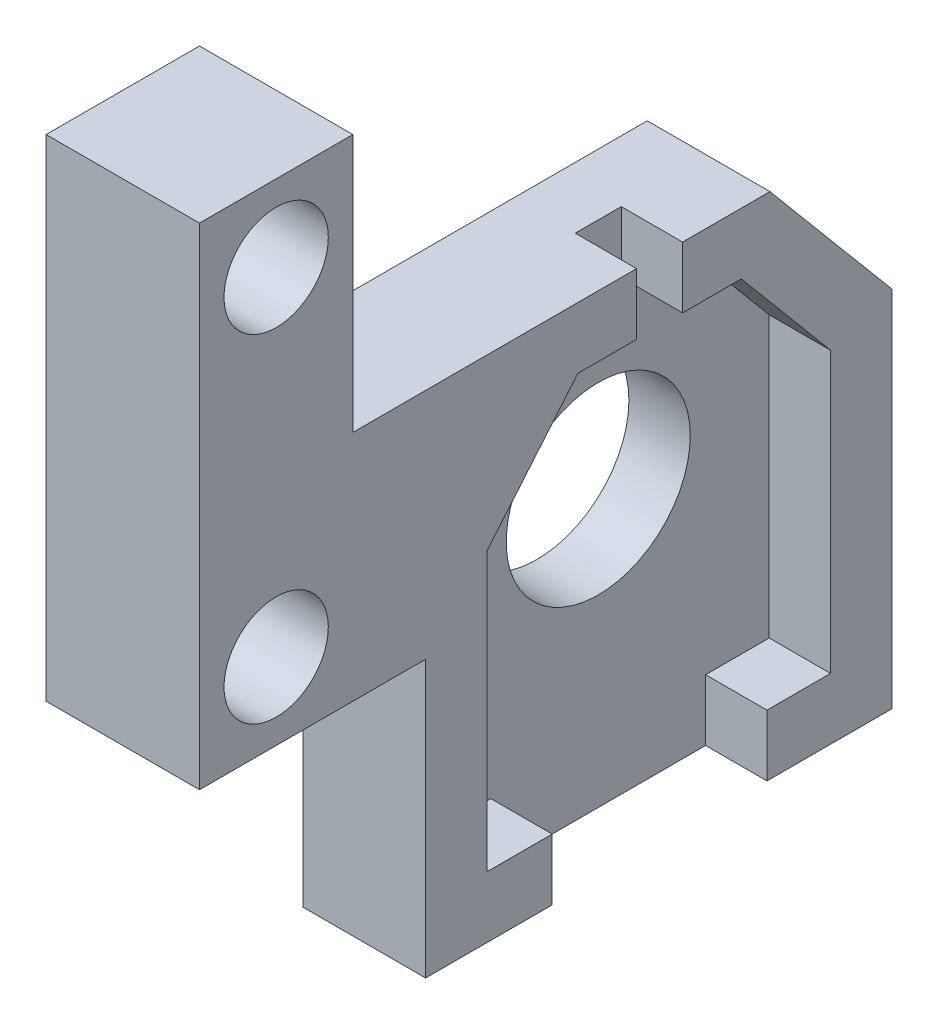
ISO-10303-21;
HEADER;
FILE_DESCRIPTION(('STEP AP214'),'2;1');
FILE_NAME('part.step','',(''),(''),'','','');
FILE_SCHEMA(('AUTOMOTIVE_DESIGN { 1 0 10303 214 1 1 1 1 }'));
ENDSEC;
DATA;
#1=APPLICATION_CONTEXT('core data for automotive mechanical design processes');
#2=APPLICATION_PROTOCOL_DEFINITION('international standard','automotive_design',2000,#1);
#3=PRODUCT_CONTEXT('',#1,'mechanical');
#4=PRODUCT('Part','Part','',(#3));
#5=PRODUCT_RELATED_PRODUCT_CATEGORY('part','',(#4));
#6=PRODUCT_DEFINITION_FORMATION('','',#4);
#7=PRODUCT_DEFINITION_CONTEXT('part definition',#1,'design');
#8=PRODUCT_DEFINITION('design','',#6,#7);
#9=PRODUCT_DEFINITION_SHAPE('','',#8);
#10=(LENGTH_UNIT() NAMED_UNIT(*) SI_UNIT(.MILLI.,.METRE.));
#11=(NAMED_UNIT(*) PLANE_ANGLE_UNIT() SI_UNIT($,.RADIAN.));
#12=(NAMED_UNIT(*) SI_UNIT($,.STERADIAN.) SOLID_ANGLE_UNIT());
#13=UNCERTAINTY_MEASURE_WITH_UNIT(LENGTH_MEASURE(1.E-05),#10,'distance_accuracy_value','');
#14=(GEOMETRIC_REPRESENTATION_CONTEXT(3) GLOBAL_UNCERTAINTY_ASSIGNED_CONTEXT((#13)) GLOBAL_UNIT_ASSIGNED_CONTEXT((#10,
#11,#12)) REPRESENTATION_CONTEXT('',''));
#15=CARTESIAN_POINT('',(0.,0.,0.));
#16=DIRECTION('',(0.,0.,1.));
#17=DIRECTION('',(1.,0.,0.));
#18=AXIS2_PLACEMENT_3D('',#15,#16,#17);
#19=CARTESIAN_POINT('',(0.,0.,0.));
#20=DIRECTION('',(-1.,0.,0.));
#21=DIRECTION('',(0.,0.,1.));
#22=AXIS2_PLACEMENT_3D('',#19,#20,#21);
#23=PLANE('',#22);
#24=CARTESIAN_POINT('',(0.,1.90865976235804,0.482116569244563));
#25=DIRECTION('',(1.,0.,0.));
#26=DIRECTION('',(0.,0.,-1.));
#27=AXIS2_PLACEMENT_3D('',#24,#25,#26);
#28=CIRCLE('',#27,3.);
#29=CARTESIAN_POINT('',(0.,1.90865976235804,-2.51788343075544));
#30=VERTEX_POINT('',#29);
#31=EDGE_CURVE('E226',#30,#30,#28,.T.);
#32=ORIENTED_EDGE('',*,*,#31,.F.);
#33=EDGE_LOOP('',(#32));
#34=FACE_BOUND('',#33,.T.);
#35=DIRECTION('',(0.,1.,0.));
#36=VECTOR('',#35,1.);
#37=CARTESIAN_POINT('',(0.,7.49865976235804,1.23211656924456));
#38=LINE('',#37,#36);
#39=CARTESIAN_POINT('',(0.,7.49865976235804,1.23211656924456));
#40=VERTEX_POINT('',#39);
#41=CARTESIAN_POINT('',(0.,9.49865976235804,1.23211656924456));
#42=VERTEX_POINT('',#41);
#43=EDGE_CURVE('E65',#40,#42,#38,.T.);
#44=ORIENTED_EDGE('',*,*,#43,.F.);
#45=DIRECTION('',(0.,0.,-1.));
#46=VECTOR('',#45,1.);
#47=CARTESIAN_POINT('',(0.,7.49865976235804,3.14728681258254));
#48=LINE('',#47,#46);
#49=CARTESIAN_POINT('',(0.,7.49865976235804,3.14728681258254));
#50=VERTEX_POINT('',#49);
#51=EDGE_CURVE('E417',#50,#40,#48,.T.);
#52=ORIENTED_EDGE('',*,*,#51,.F.);
#53=DIRECTION('',(0.,0.766044443118982,-0.642787609686534));
#54=VECTOR('',#53,1.);
#55=CARTESIAN_POINT('',(0.,3.96865976235804,6.1093085106383));
#56=LINE('',#55,#54);
#57=CARTESIAN_POINT('',(0.,3.96865976235804,6.1093085106383));
#58=VERTEX_POINT('',#57);
#59=EDGE_CURVE('E413',#58,#50,#56,.T.);
#60=ORIENTED_EDGE('',*,*,#59,.F.);
#61=DIRECTION('',(0.,1.,0.));
#62=VECTOR('',#61,1.);
#63=CARTESIAN_POINT('',(0.,3.96865976235804,6.1093085106383));
#64=LINE('',#63,#62);
#65=CARTESIAN_POINT('',(0.,-5.09134023764196,6.1093085106383));
#66=VERTEX_POINT('',#65);
#67=EDGE_CURVE('E408',#66,#58,#64,.T.);
#68=ORIENTED_EDGE('',*,*,#67,.F.);
#69=DIRECTION('',(0.,0.,1.));
#70=VECTOR('',#69,1.);
#71=CARTESIAN_POINT('',(0.,-5.09134023764196,6.1093085106383));
#72=LINE('',#71,#70);
#73=CARTESIAN_POINT('',(0.,-5.09134023764196,3.98211656924456));
#74=VERTEX_POINT('',#73);
#75=EDGE_CURVE('E404',#74,#66,#72,.T.);
#76=ORIENTED_EDGE('',*,*,#75,.F.);
#77=DIRECTION('',(0.,1.,0.));
#78=VECTOR('',#77,1.);
#79=CARTESIAN_POINT('',(0.,-5.09134023764196,3.98211656924456));
#80=LINE('',#79,#78);
#81=CARTESIAN_POINT('',(0.,-7.09134023764196,3.98211656924456));
#82=VERTEX_POINT('',#81);
#83=EDGE_CURVE('E422',#82,#74,#80,.T.);
#84=ORIENTED_EDGE('',*,*,#83,.F.);
#85=DIRECTION('',(0.,0.,-1.));
#86=VECTOR('',#85,1.);
#87=CARTESIAN_POINT('',(0.,-7.09134023764196,-7.0906914893617));
#88=LINE('',#87,#86);
#89=CARTESIAN_POINT('',(0.,-7.09134023764196,-3.01788343075544));
#90=VERTEX_POINT('',#89);
#91=EDGE_CURVE('E245',#82,#90,#88,.T.);
#92=ORIENTED_EDGE('',*,*,#91,.T.);
#93=DIRECTION('',(0.,-1.,0.));
#94=VECTOR('',#93,1.);
#95=CARTESIAN_POINT('',(0.,-5.09134023764196,-3.01788343075544));
#96=LINE('',#95,#94);
#97=CARTESIAN_POINT('',(0.,-5.09134023764196,-3.01788343075544));
#98=VERTEX_POINT('',#97);
#99=EDGE_CURVE('E305',#98,#90,#96,.T.);
#100=ORIENTED_EDGE('',*,*,#99,.F.);
#101=DIRECTION('',(0.,0.,1.));
#102=VECTOR('',#101,1.);
#103=CARTESIAN_POINT('',(0.,-5.09134023764196,-3.01788343075544));
#104=LINE('',#103,#102);
#105=CARTESIAN_POINT('',(0.,-5.09134023764196,-5.0906914893617));
#106=VERTEX_POINT('',#105);
#107=EDGE_CURVE('E301',#106,#98,#104,.T.);
#108=ORIENTED_EDGE('',*,*,#107,.F.);
#109=DIRECTION('',(0.,-1.,0.));
#110=VECTOR('',#109,1.);
#111=CARTESIAN_POINT('',(0.,4.03347195004924,-5.0906914893617));
#112=LINE('',#111,#110);
#113=CARTESIAN_POINT('',(0.,4.03347195004924,-5.0906914893617));
#114=VERTEX_POINT('',#113);
#115=EDGE_CURVE('E297',#114,#106,#112,.T.);
#116=ORIENTED_EDGE('',*,*,#115,.F.);
#117=DIRECTION('',(0.,-0.766044443118981,-0.642787609686535));
#118=VECTOR('',#117,1.);
#119=CARTESIAN_POINT('',(0.,4.03347195004924,-5.0906914893617));
#120=LINE('',#119,#118);
#121=CARTESIAN_POINT('',(0.,7.49865976235804,-2.18305367409341));
#122=VERTEX_POINT('',#121);
#123=EDGE_CURVE('E292',#122,#114,#120,.T.);
#124=ORIENTED_EDGE('',*,*,#123,.F.);
#125=DIRECTION('',(0.,0.,-1.));
#126=VECTOR('',#125,1.);
#127=CARTESIAN_POINT('',(0.,7.49865976235804,-0.267883430755437));
#128=LINE('',#127,#126);
#129=CARTESIAN_POINT('',(0.,7.49865976235804,-0.267883430755437));
#130=VERTEX_POINT('',#129);
#131=EDGE_CURVE('E288',#130,#122,#128,.T.);
#132=ORIENTED_EDGE('',*,*,#131,.F.);
#133=DIRECTION('',(0.,-1.,0.));
#134=VECTOR('',#133,1.);
#135=CARTESIAN_POINT('',(0.,7.49865976235804,-0.267883430755437));
#136=LINE('',#135,#134);
#137=CARTESIAN_POINT('',(0.,9.49865976235804,-0.267883430755437));
#138=VERTEX_POINT('',#137);
#139=EDGE_CURVE('E309',#138,#130,#136,.T.);
#140=ORIENTED_EDGE('',*,*,#139,.F.);
#141=DIRECTION('',(0.,0.,1.));
#142=VECTOR('',#141,1.);
#143=CARTESIAN_POINT('',(0.,9.49865976235804,4.07990212889255));
#144=LINE('',#143,#142);
#145=EDGE_CURVE('E248',#138,#42,#144,.T.);
#146=ORIENTED_EDGE('',*,*,#145,.T.);
#147=EDGE_LOOP('',(#44,#52,#60,#68,#76,#84,#92,#100,#108,#116,#124,#132,#140,#146));
#148=FACE_BOUND('',#147,.T.);
#149=ADVANCED_FACE('F39',(#34,#148),#23,.F.);
#150=CARTESIAN_POINT('',(-2.,-7.09134023764196,-7.0906914893617));
#151=DIRECTION('',(0.,-1.,0.));
#152=DIRECTION('',(0.,0.,-1.));
#153=AXIS2_PLACEMENT_3D('',#150,#151,#152);
#154=PLANE('',#153);
#155=ORIENTED_EDGE('',*,*,#91,.F.);
#156=DIRECTION('',(-1.,0.,0.));
#157=VECTOR('',#156,1.);
#158=CARTESIAN_POINT('',(2.,-7.09134023764196,3.98211656924456));
#159=LINE('',#158,#157);
#160=CARTESIAN_POINT('',(2.,-7.09134023764196,3.98211656924456));
#161=VERTEX_POINT('',#160);
#162=EDGE_CURVE('E390',#161,#82,#159,.T.);
#163=ORIENTED_EDGE('',*,*,#162,.F.);
#164=DIRECTION('',(0.,0.,-1.));
#165=VECTOR('',#164,1.);
#166=CARTESIAN_POINT('',(2.,-7.09134023764196,8.1093085106383));
#167=LINE('',#166,#165);
#168=CARTESIAN_POINT('',(2.,-7.09134023764196,8.1093085106383));
#169=VERTEX_POINT('',#168);
#170=EDGE_CURVE('E388',#169,#161,#167,.T.);
#171=ORIENTED_EDGE('',*,*,#170,.F.);
#172=DIRECTION('',(1.,0.,0.));
#173=VECTOR('',#172,1.);
#174=CARTESIAN_POINT('',(-2.,-7.09134023764196,8.1093085106383));
#175=LINE('',#174,#173);
#176=CARTESIAN_POINT('',(-2.,-7.09134023764196,8.1093085106383));
#177=VERTEX_POINT('',#176);
#178=EDGE_CURVE('E11',#177,#169,#175,.T.);
#179=ORIENTED_EDGE('',*,*,#178,.F.);
#180=DIRECTION('',(0.,0.,-1.));
#181=VECTOR('',#180,1.);
#182=CARTESIAN_POINT('',(-2.,-7.09134023764196,-7.0906914893617));
#183=LINE('',#182,#181);
#184=CARTESIAN_POINT('',(-2.,-7.09134023764196,-7.0906914893617));
#185=VERTEX_POINT('',#184);
#186=EDGE_CURVE('E234',#177,#185,#183,.T.);
#187=ORIENTED_EDGE('',*,*,#186,.T.);
#188=DIRECTION('',(1.,0.,0.));
#189=VECTOR('',#188,1.);
#190=CARTESIAN_POINT('',(-2.,-7.09134023764196,-7.0906914893617));
#191=LINE('',#190,#189);
#192=CARTESIAN_POINT('',(2.,-7.09134023764196,-7.0906914893617));
#193=VERTEX_POINT('',#192);
#194=EDGE_CURVE('E43',#185,#193,#191,.T.);
#195=ORIENTED_EDGE('',*,*,#194,.T.);
#196=DIRECTION('',(0.,0.,-1.));
#197=VECTOR('',#196,1.);
#198=CARTESIAN_POINT('',(2.,-7.09134023764196,-3.01788343075544));
#199=LINE('',#198,#197);
#200=CARTESIAN_POINT('',(2.,-7.09134023764196,-3.01788343075544));
#201=VERTEX_POINT('',#200);
#202=EDGE_CURVE('E273',#201,#193,#199,.T.);
#203=ORIENTED_EDGE('',*,*,#202,.F.);
#204=DIRECTION('',(-1.,0.,0.));
#205=VECTOR('',#204,1.);
#206=CARTESIAN_POINT('',(2.,-7.09134023764196,-3.01788343075544));
#207=LINE('',#206,#205);
#208=EDGE_CURVE('E321',#201,#90,#207,.T.);
#209=ORIENTED_EDGE('',*,*,#208,.T.);
#210=EDGE_LOOP('',(#155,#163,#171,#179,#187,#195,#203,#209));
#211=FACE_BOUND('',#210,.T.);
#212=ADVANCED_FACE('F41',(#211),#154,.T.);
#213=CARTESIAN_POINT('',(-2.,-7.09134023764196,8.1093085106383));
#214=DIRECTION('',(0.,0.,1.));
#215=DIRECTION('',(0.,-1.,0.));
#216=AXIS2_PLACEMENT_3D('',#213,#214,#215);
#217=PLANE('',#216);
#218=DIRECTION('',(1.,0.,0.));
#219=VECTOR('',#218,1.);
#220=CARTESIAN_POINT('',(-3.,1.90865976235804,8.1093085106383));
#221=LINE('',#220,#219);
#222=CARTESIAN_POINT('',(-2.,1.90865976235804,8.1093085106383));
#223=VERTEX_POINT('',#222);
#224=CARTESIAN_POINT('',(2.,1.90865976235804,8.1093085106383));
#225=VERTEX_POINT('',#224);
#226=EDGE_CURVE('E208',#223,#225,#221,.T.);
#227=ORIENTED_EDGE('',*,*,#226,.F.);
#228=DIRECTION('',(0.,-1.,0.));
#229=VECTOR('',#228,1.);
#230=CARTESIAN_POINT('',(-2.,-7.09134023764196,8.1093085106383));
#231=LINE('',#230,#229);
#232=EDGE_CURVE('E222',#223,#177,#231,.T.);
#233=ORIENTED_EDGE('',*,*,#232,.T.);
#234=ORIENTED_EDGE('',*,*,#178,.T.);
#235=DIRECTION('',(0.,-1.,0.));
#236=VECTOR('',#235,1.);
#237=CARTESIAN_POINT('',(2.,4.69660023089044,8.1093085106383));
#238=LINE('',#237,#236);
#239=EDGE_CURVE('E224',#225,#169,#238,.T.);
#240=ORIENTED_EDGE('',*,*,#239,.F.);
#241=EDGE_LOOP('',(#227,#233,#234,#240));
#242=FACE_BOUND('',#241,.T.);
#243=ADVANCED_FACE('F221',(#242),#217,.T.);
#244=CARTESIAN_POINT('',(-2.,9.49865976235804,4.07990212889255));
#245=DIRECTION('',(0.,1.,0.));
#246=DIRECTION('',(0.,0.,1.));
#247=AXIS2_PLACEMENT_3D('',#244,#245,#246);
#248=PLANE('',#247);
#249=DIRECTION('',(0.,0.,1.));
#250=VECTOR('',#249,1.);
#251=CARTESIAN_POINT('',(-2.,9.49865976235804,4.07990212889255));
#252=LINE('',#251,#250);
#253=CARTESIAN_POINT('',(-2.,9.49865976235804,-3.11566899040342));
#254=VERTEX_POINT('',#253);
#255=CARTESIAN_POINT('',(-2.,9.49865976235804,10.4821165692446));
#256=VERTEX_POINT('',#255);
#257=EDGE_CURVE('E236',#254,#256,#252,.T.);
#258=ORIENTED_EDGE('',*,*,#257,.T.);
#259=DIRECTION('',(1.,0.,0.));
#260=VECTOR('',#259,1.);
#261=CARTESIAN_POINT('',(-3.,9.49865976235804,10.4821165692446));
#262=LINE('',#261,#260);
#263=CARTESIAN_POINT('',(2.,9.49865976235804,10.4821165692446));
#264=VERTEX_POINT('',#263);
#265=EDGE_CURVE('E349',#256,#264,#262,.T.);
#266=ORIENTED_EDGE('',*,*,#265,.T.);
#267=DIRECTION('',(0.,0.,1.));
#268=VECTOR('',#267,1.);
#269=CARTESIAN_POINT('',(2.,9.49865976235804,4.07990212889255));
#270=LINE('',#269,#268);
#271=CARTESIAN_POINT('',(2.,9.49865976235804,1.23211656924456));
#272=VERTEX_POINT('',#271);
#273=EDGE_CURVE('E400',#272,#264,#270,.T.);
#274=ORIENTED_EDGE('',*,*,#273,.F.);
#275=DIRECTION('',(-1.,0.,0.));
#276=VECTOR('',#275,1.);
#277=CARTESIAN_POINT('',(2.,9.49865976235804,1.23211656924456));
#278=LINE('',#277,#276);
#279=EDGE_CURVE('E432',#272,#42,#278,.T.);
#280=ORIENTED_EDGE('',*,*,#279,.T.);
#281=ORIENTED_EDGE('',*,*,#145,.F.);
#282=DIRECTION('',(-1.,0.,0.));
#283=VECTOR('',#282,1.);
#284=CARTESIAN_POINT('',(2.,9.49865976235804,-0.267883430755437));
#285=LINE('',#284,#283);
#286=CARTESIAN_POINT('',(2.,9.49865976235804,-0.267883430755437));
#287=VERTEX_POINT('',#286);
#288=EDGE_CURVE('E317',#287,#138,#285,.T.);
#289=ORIENTED_EDGE('',*,*,#288,.F.);
#290=DIRECTION('',(0.,0.,1.));
#291=VECTOR('',#290,1.);
#292=CARTESIAN_POINT('',(2.,9.49865976235804,-0.267883430755437));
#293=LINE('',#292,#291);
#294=CARTESIAN_POINT('',(2.,9.49865976235804,-3.11566899040342));
#295=VERTEX_POINT('',#294);
#296=EDGE_CURVE('E278',#295,#287,#293,.T.);
#297=ORIENTED_EDGE('',*,*,#296,.F.);
#298=DIRECTION('',(1.,0.,0.));
#299=VECTOR('',#298,1.);
#300=CARTESIAN_POINT('',(-2.,9.49865976235804,-3.11566899040342));
#301=LINE('',#300,#299);
#302=EDGE_CURVE('E49',#254,#295,#301,.T.);
#303=ORIENTED_EDGE('',*,*,#302,.F.);
#304=EDGE_LOOP('',(#258,#266,#274,#280,#281,#289,#297,#303));
#305=FACE_BOUND('',#304,.T.);
#306=ADVANCED_FACE('F347',(#305),#248,.T.);
#307=CARTESIAN_POINT('',(-2.,9.49865976235804,-3.11566899040342));
#308=DIRECTION('',(0.,0.642787609686535,-0.766044443118981));
#309=DIRECTION('',(0.,0.766044443118982,0.642787609686535));
#310=AXIS2_PLACEMENT_3D('',#307,#308,#309);
#311=PLANE('',#310);
#312=ORIENTED_EDGE('',*,*,#302,.T.);
#313=DIRECTION('',(0.,0.766044443118982,0.642787609686535));
#314=VECTOR('',#313,1.);
#315=CARTESIAN_POINT('',(2.,9.49865976235804,-3.11566899040342));
#316=LINE('',#315,#314);
#317=CARTESIAN_POINT('',(2.,4.76141241858164,-7.0906914893617));
#318=VERTEX_POINT('',#317);
#319=EDGE_CURVE('E270',#318,#295,#316,.T.);
#320=ORIENTED_EDGE('',*,*,#319,.F.);
#321=DIRECTION('',(1.,0.,0.));
#322=VECTOR('',#321,1.);
#323=CARTESIAN_POINT('',(-2.,4.76141241858164,-7.0906914893617));
#324=LINE('',#323,#322);
#325=CARTESIAN_POINT('',(-2.,4.76141241858164,-7.0906914893617));
#326=VERTEX_POINT('',#325);
#327=EDGE_CURVE('E240',#326,#318,#324,.T.);
#328=ORIENTED_EDGE('',*,*,#327,.F.);
#329=DIRECTION('',(0.,0.766044443118982,0.642787609686535));
#330=VECTOR('',#329,1.);
#331=CARTESIAN_POINT('',(-2.,9.49865976235804,-3.11566899040342));
#332=LINE('',#331,#330);
#333=EDGE_CURVE('E241',#326,#254,#332,.T.);
#334=ORIENTED_EDGE('',*,*,#333,.T.);
#335=EDGE_LOOP('',(#312,#320,#328,#334));
#336=FACE_BOUND('',#335,.T.);
#337=ADVANCED_FACE('F276',(#336),#311,.T.);
#338=CARTESIAN_POINT('',(-2.,4.76141241858164,-7.0906914893617));
#339=DIRECTION('',(0.,0.,-1.));
#340=DIRECTION('',(0.,1.,0.));
#341=AXIS2_PLACEMENT_3D('',#338,#339,#340);
#342=PLANE('',#341);
#343=ORIENTED_EDGE('',*,*,#327,.T.);
#344=DIRECTION('',(0.,1.,0.));
#345=VECTOR('',#344,1.);
#346=CARTESIAN_POINT('',(2.,4.76141241858164,-7.0906914893617));
#347=LINE('',#346,#345);
#348=EDGE_CURVE('E259',#193,#318,#347,.T.);
#349=ORIENTED_EDGE('',*,*,#348,.F.);
#350=ORIENTED_EDGE('',*,*,#194,.F.);
#351=DIRECTION('',(0.,1.,0.));
#352=VECTOR('',#351,1.);
#353=CARTESIAN_POINT('',(-2.,4.76141241858164,-7.0906914893617));
#354=LINE('',#353,#352);
#355=EDGE_CURVE('E260',#185,#326,#354,.T.);
#356=ORIENTED_EDGE('',*,*,#355,.T.);
#357=EDGE_LOOP('',(#343,#349,#350,#356));
#358=FACE_BOUND('',#357,.T.);
#359=ADVANCED_FACE('F258',(#358),#342,.T.);
#360=CARTESIAN_POINT('',(-2.,0.,0.));
#361=DIRECTION('',(-1.,0.,0.));
#362=DIRECTION('',(0.,0.,1.));
#363=AXIS2_PLACEMENT_3D('',#360,#361,#362);
#364=PLANE('',#363);
#365=ORIENTED_EDGE('',*,*,#232,.F.);
#366=DIRECTION('',(0.,0.,1.));
#367=VECTOR('',#366,1.);
#368=CARTESIAN_POINT('',(-2.,1.90865976235804,10.4821165692446));
#369=LINE('',#368,#367);
#370=CARTESIAN_POINT('',(-2.,1.90865976235804,10.4821165692446));
#371=VERTEX_POINT('',#370);
#372=EDGE_CURVE('E204',#223,#371,#369,.T.);
#373=ORIENTED_EDGE('',*,*,#372,.T.);
#374=DIRECTION('',(0.,1.,0.));
#375=VECTOR('',#374,1.);
#376=CARTESIAN_POINT('',(-2.,9.49865976235804,10.4821165692446));
#377=LINE('',#376,#375);
#378=EDGE_CURVE('E217',#371,#256,#377,.T.);
#379=ORIENTED_EDGE('',*,*,#378,.T.);
#380=ORIENTED_EDGE('',*,*,#257,.F.);
#381=ORIENTED_EDGE('',*,*,#333,.F.);
#382=ORIENTED_EDGE('',*,*,#355,.F.);
#383=ORIENTED_EDGE('',*,*,#186,.F.);
#384=EDGE_LOOP('',(#365,#373,#379,#380,#381,#382,#383));
#385=FACE_BOUND('',#384,.T.);
#386=CARTESIAN_POINT('',(-2.,1.90865976235804,0.482116569244563));
#387=DIRECTION('',(1.,0.,0.));
#388=DIRECTION('',(0.,0.,-1.));
#389=AXIS2_PLACEMENT_3D('',#386,#387,#388);
#390=CIRCLE('',#389,3.);
#391=CARTESIAN_POINT('',(-2.,1.90865976235804,-2.51788343075544));
#392=VERTEX_POINT('',#391);
#393=EDGE_CURVE('E409',#392,#392,#390,.T.);
#394=ORIENTED_EDGE('',*,*,#393,.T.);
#395=EDGE_LOOP('',(#394));
#396=FACE_BOUND('',#395,.T.);
#397=ADVANCED_FACE('F230',(#385,#396),#364,.T.);
#398=CARTESIAN_POINT('',(2.,7.49865976235804,-0.267883430755437));
#399=DIRECTION('',(0.,1.,0.));
#400=DIRECTION('',(0.,0.,1.));
#401=AXIS2_PLACEMENT_3D('',#398,#399,#400);
#402=PLANE('',#401);
#403=ORIENTED_EDGE('',*,*,#131,.T.);
#404=DIRECTION('',(-1.,0.,0.));
#405=VECTOR('',#404,1.);
#406=CARTESIAN_POINT('',(2.,7.49865976235804,-2.18305367409341));
#407=LINE('',#406,#405);
#408=CARTESIAN_POINT('',(2.,7.49865976235804,-2.18305367409341));
#409=VERTEX_POINT('',#408);
#410=EDGE_CURVE('E249',#409,#122,#407,.T.);
#411=ORIENTED_EDGE('',*,*,#410,.F.);
#412=DIRECTION('',(0.,0.,-1.));
#413=VECTOR('',#412,1.);
#414=CARTESIAN_POINT('',(2.,7.49865976235804,-0.267883430755437));
#415=LINE('',#414,#413);
#416=CARTESIAN_POINT('',(2.,7.49865976235804,-0.267883430755437));
#417=VERTEX_POINT('',#416);
#418=EDGE_CURVE('E313',#417,#409,#415,.T.);
#419=ORIENTED_EDGE('',*,*,#418,.F.);
#420=DIRECTION('',(-1.,0.,0.));
#421=VECTOR('',#420,1.);
#422=CARTESIAN_POINT('',(2.,7.49865976235804,-0.267883430755437));
#423=LINE('',#422,#421);
#424=EDGE_CURVE('E287',#417,#130,#423,.T.);
#425=ORIENTED_EDGE('',*,*,#424,.T.);
#426=EDGE_LOOP('',(#403,#411,#419,#425));
#427=FACE_BOUND('',#426,.T.);
#428=ADVANCED_FACE('F360',(#427),#402,.F.);
#429=CARTESIAN_POINT('',(2.,4.03347195004924,-5.0906914893617));
#430=DIRECTION('',(0.,0.642787609686535,-0.766044443118982));
#431=DIRECTION('',(0.,0.766044443118982,0.642787609686535));
#432=AXIS2_PLACEMENT_3D('',#429,#430,#431);
#433=PLANE('',#432);
#434=ORIENTED_EDGE('',*,*,#123,.T.);
#435=DIRECTION('',(-1.,0.,0.));
#436=VECTOR('',#435,1.);
#437=CARTESIAN_POINT('',(2.,4.03347195004924,-5.0906914893617));
#438=LINE('',#437,#436);
#439=CARTESIAN_POINT('',(2.,4.03347195004924,-5.0906914893617));
#440=VERTEX_POINT('',#439);
#441=EDGE_CURVE('E333',#440,#114,#438,.T.);
#442=ORIENTED_EDGE('',*,*,#441,.F.);
#443=DIRECTION('',(0.,-0.766044443118981,-0.642787609686535));
#444=VECTOR('',#443,1.);
#445=CARTESIAN_POINT('',(2.,4.03347195004924,-5.0906914893617));
#446=LINE('',#445,#444);
#447=EDGE_CURVE('E362',#409,#440,#446,.T.);
#448=ORIENTED_EDGE('',*,*,#447,.F.);
#449=ORIENTED_EDGE('',*,*,#410,.T.);
#450=EDGE_LOOP('',(#434,#442,#448,#449));
#451=FACE_BOUND('',#450,.T.);
#452=ADVANCED_FACE('F548',(#451),#433,.F.);
#453=CARTESIAN_POINT('',(2.,4.03347195004924,-5.0906914893617));
#454=DIRECTION('',(0.,0.,-1.));
#455=DIRECTION('',(0.,1.,0.));
#456=AXIS2_PLACEMENT_3D('',#453,#454,#455);
#457=PLANE('',#456);
#458=ORIENTED_EDGE('',*,*,#115,.T.);
#459=DIRECTION('',(-1.,0.,0.));
#460=VECTOR('',#459,1.);
#461=CARTESIAN_POINT('',(2.,-5.09134023764196,-5.0906914893617));
#462=LINE('',#461,#460);
#463=CARTESIAN_POINT('',(2.,-5.09134023764196,-5.0906914893617));
#464=VERTEX_POINT('',#463);
#465=EDGE_CURVE('E329',#464,#106,#462,.T.);
#466=ORIENTED_EDGE('',*,*,#465,.F.);
#467=DIRECTION('',(0.,-1.,0.));
#468=VECTOR('',#467,1.);
#469=CARTESIAN_POINT('',(2.,4.03347195004924,-5.0906914893617));
#470=LINE('',#469,#468);
#471=EDGE_CURVE('E365',#440,#464,#470,.T.);
#472=ORIENTED_EDGE('',*,*,#471,.F.);
#473=ORIENTED_EDGE('',*,*,#441,.T.);
#474=EDGE_LOOP('',(#458,#466,#472,#473));
#475=FACE_BOUND('',#474,.T.);
#476=ADVANCED_FACE('F552',(#475),#457,.F.);
#477=CARTESIAN_POINT('',(2.,-5.09134023764196,-3.01788343075544));
#478=DIRECTION('',(0.,-1.,0.));
#479=DIRECTION('',(0.,0.,-1.));
#480=AXIS2_PLACEMENT_3D('',#477,#478,#479);
#481=PLANE('',#480);
#482=ORIENTED_EDGE('',*,*,#107,.T.);
#483=DIRECTION('',(-1.,0.,0.));
#484=VECTOR('',#483,1.);
#485=CARTESIAN_POINT('',(2.,-5.09134023764196,-3.01788343075544));
#486=LINE('',#485,#484);
#487=CARTESIAN_POINT('',(2.,-5.09134023764196,-3.01788343075544));
#488=VERTEX_POINT('',#487);
#489=EDGE_CURVE('E325',#488,#98,#486,.T.);
#490=ORIENTED_EDGE('',*,*,#489,.F.);
#491=DIRECTION('',(0.,0.,1.));
#492=VECTOR('',#491,1.);
#493=CARTESIAN_POINT('',(2.,-5.09134023764196,-3.01788343075544));
#494=LINE('',#493,#492);
#495=EDGE_CURVE('E372',#464,#488,#494,.T.);
#496=ORIENTED_EDGE('',*,*,#495,.F.);
#497=ORIENTED_EDGE('',*,*,#465,.T.);
#498=EDGE_LOOP('',(#482,#490,#496,#497));
#499=FACE_BOUND('',#498,.T.);
#500=ADVANCED_FACE('F558',(#499),#481,.F.);
#501=CARTESIAN_POINT('',(2.,-5.09134023764196,-3.01788343075544));
#502=DIRECTION('',(0.,0.,-1.));
#503=DIRECTION('',(0.,1.,0.));
#504=AXIS2_PLACEMENT_3D('',#501,#502,#503);
#505=PLANE('',#504);
#506=ORIENTED_EDGE('',*,*,#99,.T.);
#507=ORIENTED_EDGE('',*,*,#208,.F.);
#508=DIRECTION('',(0.,-1.,0.));
#509=VECTOR('',#508,1.);
#510=CARTESIAN_POINT('',(2.,-5.09134023764196,-3.01788343075544));
#511=LINE('',#510,#509);
#512=EDGE_CURVE('E375',#488,#201,#511,.T.);
#513=ORIENTED_EDGE('',*,*,#512,.F.);
#514=ORIENTED_EDGE('',*,*,#489,.T.);
#515=EDGE_LOOP('',(#506,#507,#513,#514));
#516=FACE_BOUND('',#515,.T.);
#517=ADVANCED_FACE('F383',(#516),#505,.F.);
#518=CARTESIAN_POINT('',(2.,7.49865976235804,-0.267883430755437));
#519=DIRECTION('',(0.,0.,-1.));
#520=DIRECTION('',(-1.,0.,0.));
#521=AXIS2_PLACEMENT_3D('',#518,#519,#520);
#522=PLANE('',#521);
#523=ORIENTED_EDGE('',*,*,#139,.T.);
#524=ORIENTED_EDGE('',*,*,#424,.F.);
#525=DIRECTION('',(0.,-1.,0.));
#526=VECTOR('',#525,1.);
#527=CARTESIAN_POINT('',(2.,7.49865976235804,-0.267883430755437));
#528=LINE('',#527,#526);
#529=EDGE_CURVE('E281',#287,#417,#528,.T.);
#530=ORIENTED_EDGE('',*,*,#529,.F.);
#531=ORIENTED_EDGE('',*,*,#288,.T.);
#532=EDGE_LOOP('',(#523,#524,#530,#531));
#533=FACE_BOUND('',#532,.T.);
#534=ADVANCED_FACE('F358',(#533),#522,.F.);
#535=CARTESIAN_POINT('',(2.,0.,0.));
#536=DIRECTION('',(-1.,0.,0.));
#537=DIRECTION('',(0.,0.,1.));
#538=AXIS2_PLACEMENT_3D('',#535,#536,#537);
#539=PLANE('',#538);
#540=ORIENTED_EDGE('',*,*,#418,.T.);
#541=ORIENTED_EDGE('',*,*,#447,.T.);
#542=ORIENTED_EDGE('',*,*,#471,.T.);
#543=ORIENTED_EDGE('',*,*,#495,.T.);
#544=ORIENTED_EDGE('',*,*,#512,.T.);
#545=ORIENTED_EDGE('',*,*,#202,.T.);
#546=ORIENTED_EDGE('',*,*,#348,.T.);
#547=ORIENTED_EDGE('',*,*,#319,.T.);
#548=ORIENTED_EDGE('',*,*,#296,.T.);
#549=ORIENTED_EDGE('',*,*,#529,.T.);
#550=EDGE_LOOP('',(#540,#541,#542,#543,#544,#545,#546,#547,#548,#549));
#551=FACE_BOUND('',#550,.T.);
#552=ADVANCED_FACE('F269',(#551),#539,.F.);
#553=CARTESIAN_POINT('',(2.,-5.09134023764196,6.1093085106383));
#554=DIRECTION('',(0.,-1.,0.));
#555=DIRECTION('',(0.,0.,-1.));
#556=AXIS2_PLACEMENT_3D('',#553,#554,#555);
#557=PLANE('',#556);
#558=ORIENTED_EDGE('',*,*,#75,.T.);
#559=DIRECTION('',(-1.,0.,0.));
#560=VECTOR('',#559,1.);
#561=CARTESIAN_POINT('',(2.,-5.09134023764196,6.1093085106383));
#562=LINE('',#561,#560);
#563=CARTESIAN_POINT('',(2.,-5.09134023764196,6.1093085106383));
#564=VERTEX_POINT('',#563);
#565=EDGE_CURVE('E293',#564,#66,#562,.T.);
#566=ORIENTED_EDGE('',*,*,#565,.F.);
#567=DIRECTION('',(0.,0.,1.));
#568=VECTOR('',#567,1.);
#569=CARTESIAN_POINT('',(2.,-5.09134023764196,6.1093085106383));
#570=LINE('',#569,#568);
#571=CARTESIAN_POINT('',(2.,-5.09134023764196,3.98211656924456));
#572=VERTEX_POINT('',#571);
#573=EDGE_CURVE('E426',#572,#564,#570,.T.);
#574=ORIENTED_EDGE('',*,*,#573,.F.);
#575=DIRECTION('',(-1.,0.,0.));
#576=VECTOR('',#575,1.);
#577=CARTESIAN_POINT('',(2.,-5.09134023764196,3.98211656924456));
#578=LINE('',#577,#576);
#579=EDGE_CURVE('E398',#572,#74,#578,.T.);
#580=ORIENTED_EDGE('',*,*,#579,.T.);
#581=EDGE_LOOP('',(#558,#566,#574,#580));
#582=FACE_BOUND('',#581,.T.);
#583=ADVANCED_FACE('F458',(#582),#557,.F.);
#584=CARTESIAN_POINT('',(2.,3.96865976235804,6.1093085106383));
#585=DIRECTION('',(0.,0.,1.));
#586=DIRECTION('',(0.,-1.,0.));
#587=AXIS2_PLACEMENT_3D('',#584,#585,#586);
#588=PLANE('',#587);
#589=ORIENTED_EDGE('',*,*,#67,.T.);
#590=DIRECTION('',(-1.,0.,0.));
#591=VECTOR('',#590,1.);
#592=CARTESIAN_POINT('',(2.,3.96865976235804,6.1093085106383));
#593=LINE('',#592,#591);
#594=CARTESIAN_POINT('',(2.,3.96865976235804,6.1093085106383));
#595=VERTEX_POINT('',#594);
#596=EDGE_CURVE('E443',#595,#58,#593,.T.);
#597=ORIENTED_EDGE('',*,*,#596,.F.);
#598=DIRECTION('',(0.,1.,0.));
#599=VECTOR('',#598,1.);
#600=CARTESIAN_POINT('',(2.,3.96865976235804,6.1093085106383));
#601=LINE('',#600,#599);
#602=EDGE_CURVE('E454',#564,#595,#601,.T.);
#603=ORIENTED_EDGE('',*,*,#602,.F.);
#604=ORIENTED_EDGE('',*,*,#565,.T.);
#605=EDGE_LOOP('',(#589,#597,#603,#604));
#606=FACE_BOUND('',#605,.T.);
#607=ADVANCED_FACE('F453',(#606),#588,.F.);
#608=CARTESIAN_POINT('',(2.,3.96865976235804,6.1093085106383));
#609=DIRECTION('',(0.,0.642787609686534,0.766044443118982));
#610=DIRECTION('',(0.,-0.766044443118982,0.642787609686534));
#611=AXIS2_PLACEMENT_3D('',#608,#609,#610);
#612=PLANE('',#611);
#613=ORIENTED_EDGE('',*,*,#59,.T.);
#614=DIRECTION('',(-1.,0.,0.));
#615=VECTOR('',#614,1.);
#616=CARTESIAN_POINT('',(2.,7.49865976235804,3.14728681258254));
#617=LINE('',#616,#615);
#618=CARTESIAN_POINT('',(2.,7.49865976235804,3.14728681258254));
#619=VERTEX_POINT('',#618);
#620=EDGE_CURVE('E440',#619,#50,#617,.T.);
#621=ORIENTED_EDGE('',*,*,#620,.F.);
#622=DIRECTION('',(0.,0.766044443118982,-0.642787609686534));
#623=VECTOR('',#622,1.);
#624=CARTESIAN_POINT('',(2.,3.96865976235804,6.1093085106383));
#625=LINE('',#624,#623);
#626=EDGE_CURVE('E467',#595,#619,#625,.T.);
#627=ORIENTED_EDGE('',*,*,#626,.F.);
#628=ORIENTED_EDGE('',*,*,#596,.T.);
#629=EDGE_LOOP('',(#613,#621,#627,#628));
#630=FACE_BOUND('',#629,.T.);
#631=ADVANCED_FACE('F573',(#630),#612,.F.);
#632=CARTESIAN_POINT('',(2.,7.49865976235804,3.14728681258254));
#633=DIRECTION('',(0.,1.,0.));
#634=DIRECTION('',(0.,0.,1.));
#635=AXIS2_PLACEMENT_3D('',#632,#633,#634);
#636=PLANE('',#635);
#637=ORIENTED_EDGE('',*,*,#51,.T.);
#638=DIRECTION('',(-1.,0.,0.));
#639=VECTOR('',#638,1.);
#640=CARTESIAN_POINT('',(2.,7.49865976235804,1.23211656924456));
#641=LINE('',#640,#639);
#642=CARTESIAN_POINT('',(2.,7.49865976235804,1.23211656924456));
#643=VERTEX_POINT('',#642);
#644=EDGE_CURVE('E436',#643,#40,#641,.T.);
#645=ORIENTED_EDGE('',*,*,#644,.F.);
#646=DIRECTION('',(0.,0.,-1.));
#647=VECTOR('',#646,1.);
#648=CARTESIAN_POINT('',(2.,7.49865976235804,3.14728681258254));
#649=LINE('',#648,#647);
#650=EDGE_CURVE('E474',#619,#643,#649,.T.);
#651=ORIENTED_EDGE('',*,*,#650,.F.);
#652=ORIENTED_EDGE('',*,*,#620,.T.);
#653=EDGE_LOOP('',(#637,#645,#651,#652));
#654=FACE_BOUND('',#653,.T.);
#655=ADVANCED_FACE('F576',(#654),#636,.F.);
#656=CARTESIAN_POINT('',(2.,7.49865976235804,1.23211656924456));
#657=DIRECTION('',(0.,0.,1.));
#658=DIRECTION('',(1.,0.,0.));
#659=AXIS2_PLACEMENT_3D('',#656,#657,#658);
#660=PLANE('',#659);
#661=ORIENTED_EDGE('',*,*,#43,.T.);
#662=ORIENTED_EDGE('',*,*,#279,.F.);
#663=DIRECTION('',(0.,1.,0.));
#664=VECTOR('',#663,1.);
#665=CARTESIAN_POINT('',(2.,7.49865976235804,1.23211656924456));
#666=LINE('',#665,#664);
#667=EDGE_CURVE('E477',#643,#272,#666,.T.);
#668=ORIENTED_EDGE('',*,*,#667,.F.);
#669=ORIENTED_EDGE('',*,*,#644,.T.);
#670=EDGE_LOOP('',(#661,#662,#668,#669));
#671=FACE_BOUND('',#670,.T.);
#672=ADVANCED_FACE('F579',(#671),#660,.F.);
#673=CARTESIAN_POINT('',(2.,-5.09134023764196,3.98211656924456));
#674=DIRECTION('',(0.,0.,1.));
#675=DIRECTION('',(1.,0.,0.));
#676=AXIS2_PLACEMENT_3D('',#673,#674,#675);
#677=PLANE('',#676);
#678=ORIENTED_EDGE('',*,*,#83,.T.);
#679=ORIENTED_EDGE('',*,*,#579,.F.);
#680=DIRECTION('',(0.,1.,0.));
#681=VECTOR('',#680,1.);
#682=CARTESIAN_POINT('',(2.,-5.09134023764196,3.98211656924456));
#683=LINE('',#682,#681);
#684=EDGE_CURVE('E394',#161,#572,#683,.T.);
#685=ORIENTED_EDGE('',*,*,#684,.F.);
#686=ORIENTED_EDGE('',*,*,#162,.T.);
#687=EDGE_LOOP('',(#678,#679,#685,#686));
#688=FACE_BOUND('',#687,.T.);
#689=ADVANCED_FACE('F461',(#688),#677,.F.);
#690=CARTESIAN_POINT('',(2.,0.,0.));
#691=DIRECTION('',(-1.,0.,0.));
#692=DIRECTION('',(0.,0.,1.));
#693=AXIS2_PLACEMENT_3D('',#690,#691,#692);
#694=PLANE('',#693);
#695=DIRECTION('',(0.,0.,-1.));
#696=VECTOR('',#695,1.);
#697=CARTESIAN_POINT('',(2.,1.90865976235804,15.4821165692446));
#698=LINE('',#697,#696);
#699=CARTESIAN_POINT('',(2.,1.90865976235804,15.4821165692446));
#700=VERTEX_POINT('',#699);
#701=EDGE_CURVE('E508',#700,#225,#698,.T.);
#702=ORIENTED_EDGE('',*,*,#701,.T.);
#703=ORIENTED_EDGE('',*,*,#239,.T.);
#704=ORIENTED_EDGE('',*,*,#170,.T.);
#705=ORIENTED_EDGE('',*,*,#684,.T.);
#706=ORIENTED_EDGE('',*,*,#573,.T.);
#707=ORIENTED_EDGE('',*,*,#602,.T.);
#708=ORIENTED_EDGE('',*,*,#626,.T.);
#709=ORIENTED_EDGE('',*,*,#650,.T.);
#710=ORIENTED_EDGE('',*,*,#667,.T.);
#711=ORIENTED_EDGE('',*,*,#273,.T.);
#712=DIRECTION('',(0.,1.,0.));
#713=VECTOR('',#712,1.);
#714=CARTESIAN_POINT('',(2.,17.908659762358,10.4821165692446));
#715=LINE('',#714,#713);
#716=CARTESIAN_POINT('',(2.,17.908659762358,10.4821165692446));
#717=VERTEX_POINT('',#716);
#718=EDGE_CURVE('E483',#264,#717,#715,.T.);
#719=ORIENTED_EDGE('',*,*,#718,.T.);
#720=DIRECTION('',(0.,0.,1.));
#721=VECTOR('',#720,1.);
#722=CARTESIAN_POINT('',(2.,17.908659762358,15.4821165692446));
#723=LINE('',#722,#721);
#724=CARTESIAN_POINT('',(2.,17.908659762358,15.4821165692446));
#725=VERTEX_POINT('',#724);
#726=EDGE_CURVE('E491',#717,#725,#723,.T.);
#727=ORIENTED_EDGE('',*,*,#726,.T.);
#728=DIRECTION('',(0.,-1.,0.));
#729=VECTOR('',#728,1.);
#730=CARTESIAN_POINT('',(2.,17.908659762358,15.4821165692446));
#731=LINE('',#730,#729);
#732=EDGE_CURVE('E496',#725,#700,#731,.T.);
#733=ORIENTED_EDGE('',*,*,#732,.T.);
#734=EDGE_LOOP('',(#702,#703,#704,#705,#706,#707,#708,#709,#710,#711,#719,#727,#733));
#735=FACE_BOUND('',#734,.T.);
#736=CARTESIAN_POINT('',(2.,15.408659762358,12.9821165692446));
#737=DIRECTION('',(1.,0.,0.));
#738=DIRECTION('',(0.,0.,-1.));
#739=AXIS2_PLACEMENT_3D('',#736,#737,#738);
#740=CIRCLE('',#739,1.7);
#741=CARTESIAN_POINT('',(2.,15.408659762358,11.2821165692446));
#742=VERTEX_POINT('',#741);
#743=EDGE_CURVE('E622',#742,#742,#740,.T.);
#744=ORIENTED_EDGE('',*,*,#743,.F.);
#745=EDGE_LOOP('',(#744));
#746=FACE_BOUND('',#745,.T.);
#747=CARTESIAN_POINT('',(2.,4.40865976235804,12.9821165692446));
#748=DIRECTION('',(1.,0.,0.));
#749=DIRECTION('',(0.,0.,-1.));
#750=AXIS2_PLACEMENT_3D('',#747,#748,#749);
#751=CIRCLE('',#750,1.7);
#752=CARTESIAN_POINT('',(2.,4.40865976235804,11.2821165692446));
#753=VERTEX_POINT('',#752);
#754=EDGE_CURVE('E499',#753,#753,#751,.T.);
#755=ORIENTED_EDGE('',*,*,#754,.F.);
#756=EDGE_LOOP('',(#755));
#757=FACE_BOUND('',#756,.T.);
#758=ADVANCED_FACE('F462',(#735,#746,#757),#694,.F.);
#759=CARTESIAN_POINT('',(-2.,1.90865976235804,0.482116569244563));
#760=DIRECTION('',(1.,0.,0.));
#761=DIRECTION('',(0.,0.,-1.));
#762=AXIS2_PLACEMENT_3D('',#759,#760,#761);
#763=CYLINDRICAL_SURFACE('',#762,3.);
#764=ORIENTED_EDGE('',*,*,#393,.F.);
#765=EDGE_LOOP('',(#764));
#766=FACE_BOUND('',#765,.T.);
#767=ORIENTED_EDGE('',*,*,#31,.T.);
#768=EDGE_LOOP('',(#767));
#769=FACE_BOUND('',#768,.T.);
#770=ADVANCED_FACE('F526',(#766,#769),#763,.F.);
#771=CARTESIAN_POINT('',(-3.,1.90865976235804,15.4821165692446));
#772=DIRECTION('',(0.,-1.,0.));
#773=DIRECTION('',(0.,0.,-1.));
#774=AXIS2_PLACEMENT_3D('',#771,#772,#773);
#775=PLANE('',#774);
#776=DIRECTION('',(-1.,0.,0.));
#777=VECTOR('',#776,1.);
#778=CARTESIAN_POINT('',(-2.,1.90865976235804,10.4821165692446));
#779=LINE('',#778,#777);
#780=CARTESIAN_POINT('',(-3.,1.90865976235804,10.4821165692446));
#781=VERTEX_POINT('',#780);
#782=EDGE_CURVE('E211',#371,#781,#779,.T.);
#783=ORIENTED_EDGE('',*,*,#782,.F.);
#784=ORIENTED_EDGE('',*,*,#372,.F.);
#785=ORIENTED_EDGE('',*,*,#226,.T.);
#786=ORIENTED_EDGE('',*,*,#701,.F.);
#787=DIRECTION('',(1.,0.,0.));
#788=VECTOR('',#787,1.);
#789=CARTESIAN_POINT('',(-3.,1.90865976235804,15.4821165692446));
#790=LINE('',#789,#788);
#791=CARTESIAN_POINT('',(-3.,1.90865976235804,15.4821165692446));
#792=VERTEX_POINT('',#791);
#793=EDGE_CURVE('E227',#792,#700,#790,.T.);
#794=ORIENTED_EDGE('',*,*,#793,.F.);
#795=DIRECTION('',(0.,0.,-1.));
#796=VECTOR('',#795,1.);
#797=CARTESIAN_POINT('',(-3.,1.90865976235804,15.4821165692446));
#798=LINE('',#797,#796);
#799=EDGE_CURVE('E502',#792,#781,#798,.T.);
#800=ORIENTED_EDGE('',*,*,#799,.T.);
#801=EDGE_LOOP('',(#783,#784,#785,#786,#794,#800));
#802=FACE_BOUND('',#801,.T.);
#803=ADVANCED_FACE('F206',(#802),#775,.T.);
#804=CARTESIAN_POINT('',(-3.,17.908659762358,15.4821165692446));
#805=DIRECTION('',(0.,0.,1.));
#806=DIRECTION('',(1.,0.,0.));
#807=AXIS2_PLACEMENT_3D('',#804,#805,#806);
#808=PLANE('',#807);
#809=ORIENTED_EDGE('',*,*,#732,.F.);
#810=DIRECTION('',(1.,0.,0.));
#811=VECTOR('',#810,1.);
#812=CARTESIAN_POINT('',(-3.,17.908659762358,15.4821165692446));
#813=LINE('',#812,#811);
#814=CARTESIAN_POINT('',(-3.,17.908659762358,15.4821165692446));
#815=VERTEX_POINT('',#814);
#816=EDGE_CURVE('E513',#815,#725,#813,.T.);
#817=ORIENTED_EDGE('',*,*,#816,.F.);
#818=DIRECTION('',(0.,-1.,0.));
#819=VECTOR('',#818,1.);
#820=CARTESIAN_POINT('',(-3.,17.908659762358,15.4821165692446));
#821=LINE('',#820,#819);
#822=EDGE_CURVE('E638',#815,#792,#821,.T.);
#823=ORIENTED_EDGE('',*,*,#822,.T.);
#824=ORIENTED_EDGE('',*,*,#793,.T.);
#825=EDGE_LOOP('',(#809,#817,#823,#824));
#826=FACE_BOUND('',#825,.T.);
#827=ADVANCED_FACE('F597',(#826),#808,.T.);
#828=CARTESIAN_POINT('',(-3.,17.908659762358,15.4821165692446));
#829=DIRECTION('',(0.,1.,0.));
#830=DIRECTION('',(0.,0.,1.));
#831=AXIS2_PLACEMENT_3D('',#828,#829,#830);
#832=PLANE('',#831);
#833=ORIENTED_EDGE('',*,*,#726,.F.);
#834=DIRECTION('',(1.,0.,0.));
#835=VECTOR('',#834,1.);
#836=CARTESIAN_POINT('',(-3.,17.908659762358,10.4821165692446));
#837=LINE('',#836,#835);
#838=CARTESIAN_POINT('',(-3.,17.908659762358,10.4821165692446));
#839=VERTEX_POINT('',#838);
#840=EDGE_CURVE('E488',#839,#717,#837,.T.);
#841=ORIENTED_EDGE('',*,*,#840,.F.);
#842=DIRECTION('',(0.,0.,1.));
#843=VECTOR('',#842,1.);
#844=CARTESIAN_POINT('',(-3.,17.908659762358,15.4821165692446));
#845=LINE('',#844,#843);
#846=EDGE_CURVE('E635',#839,#815,#845,.T.);
#847=ORIENTED_EDGE('',*,*,#846,.T.);
#848=ORIENTED_EDGE('',*,*,#816,.T.);
#849=EDGE_LOOP('',(#833,#841,#847,#848));
#850=FACE_BOUND('',#849,.T.);
#851=ADVANCED_FACE('F594',(#850),#832,.T.);
#852=CARTESIAN_POINT('',(-3.,17.908659762358,10.4821165692446));
#853=DIRECTION('',(0.,0.,-1.));
#854=DIRECTION('',(0.,1.,0.));
#855=AXIS2_PLACEMENT_3D('',#852,#853,#854);
#856=PLANE('',#855);
#857=ORIENTED_EDGE('',*,*,#718,.F.);
#858=ORIENTED_EDGE('',*,*,#265,.F.);
#859=ORIENTED_EDGE('',*,*,#378,.F.);
#860=ORIENTED_EDGE('',*,*,#782,.T.);
#861=DIRECTION('',(0.,1.,0.));
#862=VECTOR('',#861,1.);
#863=CARTESIAN_POINT('',(-3.,17.908659762358,10.4821165692446));
#864=LINE('',#863,#862);
#865=EDGE_CURVE('E57',#781,#839,#864,.T.);
#866=ORIENTED_EDGE('',*,*,#865,.T.);
#867=ORIENTED_EDGE('',*,*,#840,.T.);
#868=EDGE_LOOP('',(#857,#858,#859,#860,#866,#867));
#869=FACE_BOUND('',#868,.T.);
#870=ADVANCED_FACE('F487',(#869),#856,.T.);
#871=CARTESIAN_POINT('',(-3.,0.,0.));
#872=DIRECTION('',(1.,0.,0.));
#873=DIRECTION('',(0.,0.,-1.));
#874=AXIS2_PLACEMENT_3D('',#871,#872,#873);
#875=PLANE('',#874);
#876=CARTESIAN_POINT('',(-3.,15.408659762358,12.9821165692446));
#877=DIRECTION('',(1.,0.,0.));
#878=DIRECTION('',(0.,0.,-1.));
#879=AXIS2_PLACEMENT_3D('',#876,#877,#878);
#880=CIRCLE('',#879,1.7);
#881=CARTESIAN_POINT('',(-3.,15.408659762358,11.2821165692446));
#882=VERTEX_POINT('',#881);
#883=EDGE_CURVE('E619',#882,#882,#880,.T.);
#884=ORIENTED_EDGE('',*,*,#883,.T.);
#885=EDGE_LOOP('',(#884));
#886=FACE_BOUND('',#885,.T.);
#887=CARTESIAN_POINT('',(-3.,4.40865976235804,12.9821165692446));
#888=DIRECTION('',(1.,0.,0.));
#889=DIRECTION('',(0.,0.,-1.));
#890=AXIS2_PLACEMENT_3D('',#887,#888,#889);
#891=CIRCLE('',#890,1.7);
#892=CARTESIAN_POINT('',(-3.,4.40865976235804,11.2821165692446));
#893=VERTEX_POINT('',#892);
#894=EDGE_CURVE('E492',#893,#893,#891,.T.);
#895=ORIENTED_EDGE('',*,*,#894,.T.);
#896=EDGE_LOOP('',(#895));
#897=FACE_BOUND('',#896,.T.);
#898=ORIENTED_EDGE('',*,*,#865,.F.);
#899=ORIENTED_EDGE('',*,*,#799,.F.);
#900=ORIENTED_EDGE('',*,*,#822,.F.);
#901=ORIENTED_EDGE('',*,*,#846,.F.);
#902=EDGE_LOOP('',(#898,#899,#900,#901));
#903=FACE_BOUND('',#902,.T.);
#904=ADVANCED_FACE('F593',(#886,#897,#903),#875,.F.);
#905=CARTESIAN_POINT('',(-3.,4.40865976235804,12.9821165692446));
#906=DIRECTION('',(1.,0.,0.));
#907=DIRECTION('',(0.,0.,-1.));
#908=AXIS2_PLACEMENT_3D('',#905,#906,#907);
#909=CYLINDRICAL_SURFACE('',#908,1.7);
#910=ORIENTED_EDGE('',*,*,#894,.F.);
#911=EDGE_LOOP('',(#910));
#912=FACE_BOUND('',#911,.T.);
#913=ORIENTED_EDGE('',*,*,#754,.T.);
#914=EDGE_LOOP('',(#913));
#915=FACE_BOUND('',#914,.T.);
#916=ADVANCED_FACE('F606',(#912,#915),#909,.F.);
#917=CARTESIAN_POINT('',(-3.,15.408659762358,12.9821165692446));
#918=DIRECTION('',(1.,0.,0.));
#919=DIRECTION('',(0.,0.,-1.));
#920=AXIS2_PLACEMENT_3D('',#917,#918,#919);
#921=CYLINDRICAL_SURFACE('',#920,1.7);
#922=ORIENTED_EDGE('',*,*,#883,.F.);
#923=EDGE_LOOP('',(#922));
#924=FACE_BOUND('',#923,.T.);
#925=ORIENTED_EDGE('',*,*,#743,.T.);
#926=EDGE_LOOP('',(#925));
#927=FACE_BOUND('',#926,.T.);
#928=ADVANCED_FACE('F610',(#924,#927),#921,.F.);
#929=CLOSED_SHELL('',(#149,#212,#243,#306,#337,#359,#397,#428,#452,#476,#500,#517,#534,#552,
#583,#607,#631,#655,#672,#689,#758,#770,#803,#827,#851,#870,#904,#916,#928));
#930=MANIFOLD_SOLID_BREP('B2',#929);
#931=ADVANCED_BREP_SHAPE_REPRESENTATION('',(#18,#930),#14);
#932=SHAPE_DEFINITION_REPRESENTATION(#9,#931);
ENDSEC;
END-ISO-10303-21;
